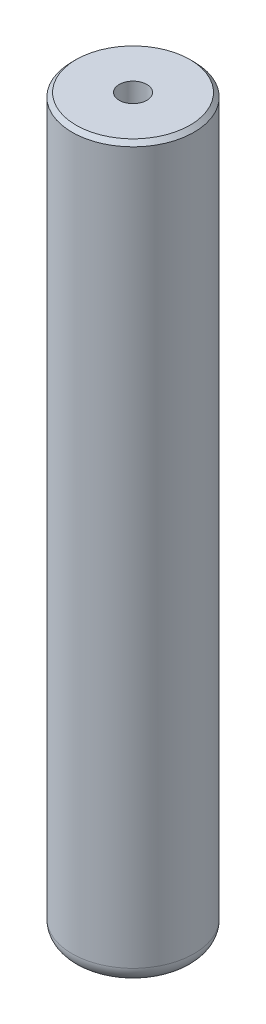
ISO-10303-21;
HEADER;
FILE_DESCRIPTION(('STEP AP214'),'2;1');
FILE_NAME('part.step','',(''),(''),'','','');
FILE_SCHEMA(('AUTOMOTIVE_DESIGN { 1 0 10303 214 1 1 1 1 }'));
ENDSEC;
DATA;
#1=APPLICATION_CONTEXT('core data for automotive mechanical design processes');
#2=APPLICATION_PROTOCOL_DEFINITION('international standard','automotive_design',2000,#1);
#3=PRODUCT_CONTEXT('',#1,'mechanical');
#4=PRODUCT('Part','Part','',(#3));
#5=PRODUCT_RELATED_PRODUCT_CATEGORY('part','',(#4));
#6=PRODUCT_DEFINITION_FORMATION('','',#4);
#7=PRODUCT_DEFINITION_CONTEXT('part definition',#1,'design');
#8=PRODUCT_DEFINITION('design','',#6,#7);
#9=PRODUCT_DEFINITION_SHAPE('','',#8);
#10=(LENGTH_UNIT() NAMED_UNIT(*) SI_UNIT(.MILLI.,.METRE.));
#11=(NAMED_UNIT(*) PLANE_ANGLE_UNIT() SI_UNIT($,.RADIAN.));
#12=(NAMED_UNIT(*) SI_UNIT($,.STERADIAN.) SOLID_ANGLE_UNIT());
#13=UNCERTAINTY_MEASURE_WITH_UNIT(LENGTH_MEASURE(1.E-05),#10,'distance_accuracy_value','');
#14=(GEOMETRIC_REPRESENTATION_CONTEXT(3) GLOBAL_UNCERTAINTY_ASSIGNED_CONTEXT((#13)) GLOBAL_UNIT_ASSIGNED_CONTEXT((#10,
#11,#12)) REPRESENTATION_CONTEXT('',''));
#15=CARTESIAN_POINT('',(0.,0.,0.));
#16=DIRECTION('',(0.,0.,1.));
#17=DIRECTION('',(1.,0.,0.));
#18=AXIS2_PLACEMENT_3D('',#15,#16,#17);
#19=CARTESIAN_POINT('',(0.,180.,0.));
#20=DIRECTION('',(0.,-1.,0.));
#21=DIRECTION('',(0.,0.,-1.));
#22=AXIS2_PLACEMENT_3D('',#19,#20,#21);
#23=CYLINDRICAL_SURFACE('',#22,15.);
#24=CARTESIAN_POINT('',(0.,179.,0.));
#25=DIRECTION('',(0.,1.,0.));
#26=DIRECTION('',(0.,0.,1.));
#27=AXIS2_PLACEMENT_3D('',#24,#25,#26);
#28=CIRCLE('',#27,15.);
#29=CARTESIAN_POINT('',(0.,179.,-15.));
#30=VERTEX_POINT('',#29);
#31=EDGE_CURVE('E11',#30,#30,#28,.F.);
#32=CARTESIAN_POINT('',(0.,3.99999999999998,0.));
#33=DIRECTION('',(0.,1.,0.));
#34=DIRECTION('',(0.,0.,1.));
#35=AXIS2_PLACEMENT_3D('',#32,#33,#34);
#36=CIRCLE('',#35,15.);
#37=CARTESIAN_POINT('',(0.,3.99999999999998,-15.));
#38=VERTEX_POINT('',#37);
#39=EDGE_CURVE('E74',#38,#38,#36,.T.);
#40=CARTESIAN_POINT('',(0.,179.,-15.));
#41=CARTESIAN_POINT('',(0.,177.177083333333,-15.));
#42=CARTESIAN_POINT('',(0.,175.354166666667,-15.));
#43=CARTESIAN_POINT('',(0.,171.708333333333,-15.));
#44=CARTESIAN_POINT('',(0.,169.885416666667,-15.));
#45=CARTESIAN_POINT('',(0.,166.239583333333,-15.));
#46=CARTESIAN_POINT('',(0.,164.416666666667,-15.));
#47=CARTESIAN_POINT('',(0.,160.770833333333,-15.));
#48=CARTESIAN_POINT('',(0.,158.947916666667,-15.));
#49=CARTESIAN_POINT('',(0.,155.302083333333,-15.));
#50=CARTESIAN_POINT('',(0.,153.479166666667,-15.));
#51=CARTESIAN_POINT('',(0.,149.833333333333,-15.));
#52=CARTESIAN_POINT('',(0.,148.010416666667,-15.));
#53=CARTESIAN_POINT('',(0.,144.364583333333,-15.));
#54=CARTESIAN_POINT('',(0.,142.541666666667,-15.));
#55=CARTESIAN_POINT('',(0.,138.895833333333,-15.));
#56=CARTESIAN_POINT('',(0.,137.072916666667,-15.));
#57=CARTESIAN_POINT('',(0.,133.427083333333,-15.));
#58=CARTESIAN_POINT('',(0.,131.604166666667,-15.));
#59=CARTESIAN_POINT('',(0.,127.958333333333,-15.));
#60=CARTESIAN_POINT('',(0.,126.135416666667,-15.));
#61=CARTESIAN_POINT('',(0.,122.489583333333,-15.));
#62=CARTESIAN_POINT('',(0.,120.666666666667,-15.));
#63=CARTESIAN_POINT('',(0.,117.020833333333,-15.));
#64=CARTESIAN_POINT('',(0.,115.197916666667,-15.));
#65=CARTESIAN_POINT('',(0.,111.552083333333,-15.));
#66=CARTESIAN_POINT('',(0.,109.729166666667,-15.));
#67=CARTESIAN_POINT('',(0.,106.083333333333,-15.));
#68=CARTESIAN_POINT('',(0.,104.260416666667,-15.));
#69=CARTESIAN_POINT('',(0.,100.614583333333,-15.));
#70=CARTESIAN_POINT('',(0.,98.7916666666667,-15.));
#71=CARTESIAN_POINT('',(0.,95.1458333333333,-15.));
#72=CARTESIAN_POINT('',(0.,93.3229166666667,-15.));
#73=CARTESIAN_POINT('',(0.,89.6770833333333,-15.));
#74=CARTESIAN_POINT('',(0.,87.8541666666667,-15.));
#75=CARTESIAN_POINT('',(0.,84.2083333333333,-15.));
#76=CARTESIAN_POINT('',(0.,82.3854166666667,-15.));
#77=CARTESIAN_POINT('',(0.,78.7395833333333,-15.));
#78=CARTESIAN_POINT('',(0.,76.9166666666667,-15.));
#79=CARTESIAN_POINT('',(0.,73.2708333333333,-15.));
#80=CARTESIAN_POINT('',(0.,71.4479166666667,-15.));
#81=CARTESIAN_POINT('',(0.,67.8020833333333,-15.));
#82=CARTESIAN_POINT('',(0.,65.9791666666667,-15.));
#83=CARTESIAN_POINT('',(0.,62.3333333333333,-15.));
#84=CARTESIAN_POINT('',(0.,60.5104166666667,-15.));
#85=CARTESIAN_POINT('',(0.,56.8645833333333,-15.));
#86=CARTESIAN_POINT('',(0.,55.0416666666667,-15.));
#87=CARTESIAN_POINT('',(0.,51.3958333333333,-15.));
#88=CARTESIAN_POINT('',(0.,49.5729166666667,-15.));
#89=CARTESIAN_POINT('',(0.,45.9270833333333,-15.));
#90=CARTESIAN_POINT('',(0.,44.1041666666667,-15.));
#91=CARTESIAN_POINT('',(0.,40.4583333333333,-15.));
#92=CARTESIAN_POINT('',(0.,38.6354166666667,-15.));
#93=CARTESIAN_POINT('',(0.,34.9895833333333,-15.));
#94=CARTESIAN_POINT('',(0.,33.1666666666667,-15.));
#95=CARTESIAN_POINT('',(0.,29.5208333333333,-15.));
#96=CARTESIAN_POINT('',(0.,27.6979166666666,-15.));
#97=CARTESIAN_POINT('',(0.,24.0520833333333,-15.));
#98=CARTESIAN_POINT('',(0.,22.2291666666667,-15.));
#99=CARTESIAN_POINT('',(0.,18.5833333333333,-15.));
#100=CARTESIAN_POINT('',(0.,16.7604166666667,-15.));
#101=CARTESIAN_POINT('',(0.,13.1145833333333,-15.));
#102=CARTESIAN_POINT('',(0.,11.2916666666666,-15.));
#103=CARTESIAN_POINT('',(0.,7.6458333333333,-15.));
#104=CARTESIAN_POINT('',(0.,5.82291666666664,-15.));
#105=CARTESIAN_POINT('',(0.,3.99999999999998,-15.));
#106=B_SPLINE_CURVE_WITH_KNOTS('',3,(#40,#41,#42,#43,#44,#45,#46,#47,#48,#49,#50,#51,#52,#53,
#54,#55,#56,#57,#58,#59,#60,#61,#62,#63,#64,#65,#66,#67,#68,#69,#70,#71,#72,#73,#74,#75,#76,#77,
#78,#79,#80,#81,#82,#83,#84,#85,#86,#87,#88,#89,#90,#91,#92,#93,#94,#95,#96,#97,#98,#99,#100,
#101,#102,#103,#104,#105),.UNSPECIFIED.,.F.,.F.,(4,2,2,2,2,2,2,2,2,2,2,2,2,2,2,2,2,2,2,2,2,2,2,
2,2,2,2,2,2,2,2,2,4),(0.,5.46874999999999,10.9375,16.40625,21.875,27.34375,32.8125,38.28125,
43.75,49.21875,54.6875,60.15625,65.625,71.09375,76.5625,82.03125,87.5,92.96875,98.4375,
103.90625,109.375,114.84375,120.3125,125.78125,131.25,136.71875,142.1875,147.65625,153.125,
158.59375,164.0625,169.53125,175.),.UNSPECIFIED.);
#107=EDGE_CURVE('BSEAM54',#30,#38,#106,.T.);
#108=ORIENTED_EDGE('',*,*,#31,.T.);
#109=ORIENTED_EDGE('',*,*,#39,.T.);
#110=ORIENTED_EDGE('',*,*,#107,.T.);
#111=ORIENTED_EDGE('',*,*,#107,.F.);
#112=EDGE_LOOP('',(#108,#110,#109,#111));
#113=FACE_BOUND('',#112,.T.);
#114=ADVANCED_FACE('F54',(#113),#23,.T.);
#115=CARTESIAN_POINT('',(0.,180.,0.));
#116=DIRECTION('',(0.,1.,0.));
#117=DIRECTION('',(0.,0.,1.));
#118=AXIS2_PLACEMENT_3D('',#115,#116,#117);
#119=PLANE('',#118);
#120=CARTESIAN_POINT('',(0.,180.,0.));
#121=DIRECTION('',(0.,1.,0.));
#122=DIRECTION('',(0.,0.,1.));
#123=AXIS2_PLACEMENT_3D('',#120,#121,#122);
#124=CIRCLE('',#123,3.39999999999999);
#125=CARTESIAN_POINT('',(0.,180.,3.39999999999999));
#126=VERTEX_POINT('',#125);
#127=EDGE_CURVE('E75',#126,#126,#124,.T.);
#128=ORIENTED_EDGE('',*,*,#127,.F.);
#129=EDGE_LOOP('',(#128));
#130=FACE_BOUND('',#129,.T.);
#131=CARTESIAN_POINT('',(0.,180.,0.));
#132=DIRECTION('',(0.,1.,0.));
#133=DIRECTION('',(0.,0.,1.));
#134=AXIS2_PLACEMENT_3D('',#131,#132,#133);
#135=CIRCLE('',#134,14.);
#136=CARTESIAN_POINT('',(0.,180.,14.));
#137=VERTEX_POINT('',#136);
#138=EDGE_CURVE('E62',#137,#137,#135,.T.);
#139=ORIENTED_EDGE('',*,*,#138,.T.);
#140=EDGE_LOOP('',(#139));
#141=FACE_BOUND('',#140,.T.);
#142=ADVANCED_FACE('F87',(#130,#141),#119,.T.);
#143=CARTESIAN_POINT('',(0.,0.,0.));
#144=DIRECTION('',(0.,1.,0.));
#145=DIRECTION('',(0.,0.,1.));
#146=AXIS2_PLACEMENT_3D('',#143,#144,#145);
#147=PLANE('',#146);
#148=CARTESIAN_POINT('',(0.,0.,0.));
#149=DIRECTION('',(0.,1.,0.));
#150=DIRECTION('',(0.,0.,1.));
#151=AXIS2_PLACEMENT_3D('',#148,#149,#150);
#152=CIRCLE('',#151,11.);
#153=CARTESIAN_POINT('',(0.,0.,11.));
#154=VERTEX_POINT('',#153);
#155=EDGE_CURVE('E78',#154,#154,#152,.F.);
#156=ORIENTED_EDGE('',*,*,#155,.T.);
#157=EDGE_LOOP('',(#156));
#158=FACE_BOUND('',#157,.T.);
#159=ADVANCED_FACE('F97',(#158),#147,.F.);
#160=CARTESIAN_POINT('',(0.,4.,0.));
#161=DIRECTION('',(0.,1.,0.));
#162=DIRECTION('',(0.,0.,1.));
#163=AXIS2_PLACEMENT_3D('',#160,#161,#162);
#164=TOROIDAL_SURFACE('',#163,11.,4.);
#165=ORIENTED_EDGE('',*,*,#155,.F.);
#166=EDGE_LOOP('',(#165));
#167=FACE_BOUND('',#166,.T.);
#168=ORIENTED_EDGE('',*,*,#39,.F.);
#169=EDGE_LOOP('',(#168));
#170=FACE_BOUND('',#169,.T.);
#171=ADVANCED_FACE('F90',(#167,#170),#164,.T.);
#172=CARTESIAN_POINT('',(0.,180.,0.));
#173=DIRECTION('',(0.,-1.,0.));
#174=DIRECTION('',(0.,0.,-1.));
#175=AXIS2_PLACEMENT_3D('',#172,#173,#174);
#176=CONICAL_SURFACE('',#175,14.,0.785398163397457);
#177=ORIENTED_EDGE('',*,*,#31,.F.);
#178=EDGE_LOOP('',(#177));
#179=FACE_BOUND('',#178,.T.);
#180=ORIENTED_EDGE('',*,*,#138,.F.);
#181=EDGE_LOOP('',(#180));
#182=FACE_BOUND('',#181,.T.);
#183=ADVANCED_FACE('F57',(#179,#182),#176,.T.);
#184=CARTESIAN_POINT('',(0.,160.25,0.));
#185=DIRECTION('',(0.,1.,0.));
#186=DIRECTION('',(0.,0.,1.));
#187=AXIS2_PLACEMENT_3D('',#184,#185,#186);
#188=CONICAL_SURFACE('',#187,3.39999999999999,1.02974425867665);
#189=CARTESIAN_POINT('',(0.,158.207073895306,0.));
#190=VERTEX_POINT('',#189);
#191=VERTEX_LOOP('',#190);
#192=FACE_BOUND('',#191,.T.);
#193=CARTESIAN_POINT('',(0.,160.25,0.));
#194=DIRECTION('',(0.,1.,0.));
#195=DIRECTION('',(0.,0.,1.));
#196=AXIS2_PLACEMENT_3D('',#193,#194,#195);
#197=CIRCLE('',#196,3.39999999999999);
#198=CARTESIAN_POINT('',(0.,160.25,3.39999999999999));
#199=VERTEX_POINT('',#198);
#200=EDGE_CURVE('E72',#199,#199,#197,.T.);
#201=ORIENTED_EDGE('',*,*,#200,.T.);
#202=EDGE_LOOP('',(#201));
#203=FACE_BOUND('',#202,.T.);
#204=ADVANCED_FACE('F65',(#192,#203),#188,.F.);
#205=CARTESIAN_POINT('',(0.,180.,0.));
#206=DIRECTION('',(0.,1.,0.));
#207=DIRECTION('',(0.,0.,1.));
#208=AXIS2_PLACEMENT_3D('',#205,#206,#207);
#209=CYLINDRICAL_SURFACE('',#208,3.39999999999999);
#210=ORIENTED_EDGE('',*,*,#200,.F.);
#211=EDGE_LOOP('',(#210));
#212=FACE_BOUND('',#211,.T.);
#213=ORIENTED_EDGE('',*,*,#127,.T.);
#214=EDGE_LOOP('',(#213));
#215=FACE_BOUND('',#214,.T.);
#216=ADVANCED_FACE('F68',(#212,#215),#209,.F.);
#217=CLOSED_SHELL('',(#114,#142,#159,#171,#183,#204,#216));
#218=MANIFOLD_SOLID_BREP('B2',#217);
#219=ADVANCED_BREP_SHAPE_REPRESENTATION('',(#18,#218),#14);
#220=SHAPE_DEFINITION_REPRESENTATION(#9,#219);
ENDSEC;
END-ISO-10303-21;
